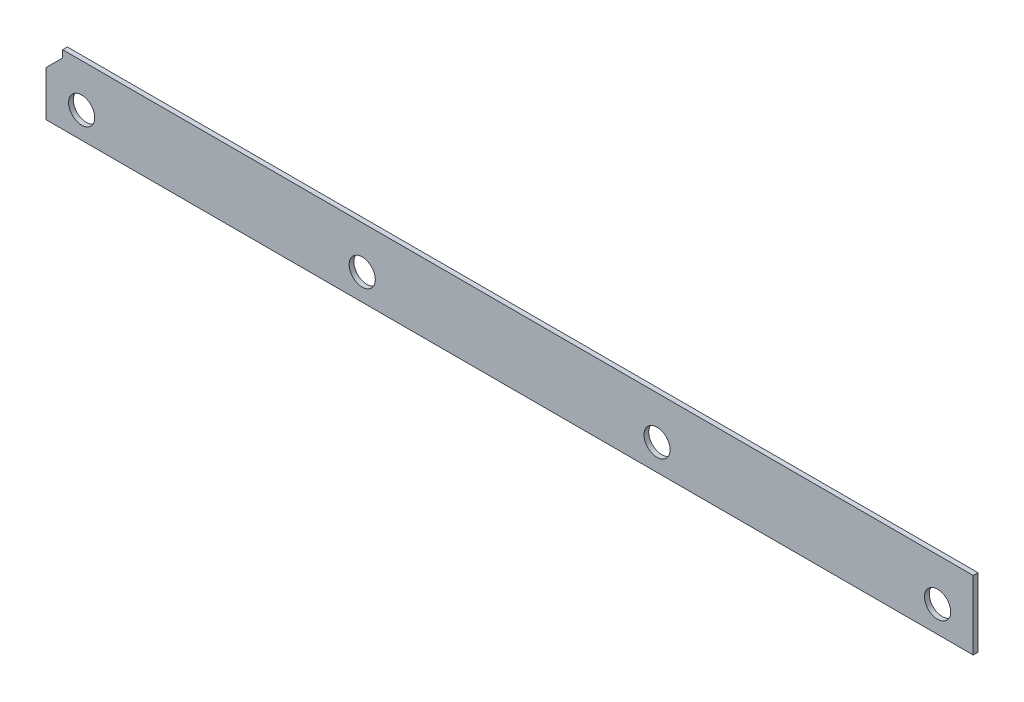
ISO-10303-21;
HEADER;
FILE_DESCRIPTION(('STEP AP214'),'2;1');
FILE_NAME('part.step','',(''),(''),'','','');
FILE_SCHEMA(('AUTOMOTIVE_DESIGN { 1 0 10303 214 1 1 1 1 }'));
ENDSEC;
DATA;
#1=APPLICATION_CONTEXT('core data for automotive mechanical design processes');
#2=APPLICATION_PROTOCOL_DEFINITION('international standard','automotive_design',2000,#1);
#3=PRODUCT_CONTEXT('',#1,'mechanical');
#4=PRODUCT('Part','Part','',(#3));
#5=PRODUCT_RELATED_PRODUCT_CATEGORY('part','',(#4));
#6=PRODUCT_DEFINITION_FORMATION('','',#4);
#7=PRODUCT_DEFINITION_CONTEXT('part definition',#1,'design');
#8=PRODUCT_DEFINITION('design','',#6,#7);
#9=PRODUCT_DEFINITION_SHAPE('','',#8);
#10=(LENGTH_UNIT() NAMED_UNIT(*) SI_UNIT(.MILLI.,.METRE.));
#11=(NAMED_UNIT(*) PLANE_ANGLE_UNIT() SI_UNIT($,.RADIAN.));
#12=(NAMED_UNIT(*) SI_UNIT($,.STERADIAN.) SOLID_ANGLE_UNIT());
#13=UNCERTAINTY_MEASURE_WITH_UNIT(LENGTH_MEASURE(1.E-05),#10,'distance_accuracy_value','');
#14=(GEOMETRIC_REPRESENTATION_CONTEXT(3) GLOBAL_UNCERTAINTY_ASSIGNED_CONTEXT((#13)) GLOBAL_UNIT_ASSIGNED_CONTEXT((#10,
#11,#12)) REPRESENTATION_CONTEXT('',''));
#15=CARTESIAN_POINT('',(0.,0.,0.));
#16=DIRECTION('',(0.,0.,1.));
#17=DIRECTION('',(1.,0.,0.));
#18=AXIS2_PLACEMENT_3D('',#15,#16,#17);
#19=CARTESIAN_POINT('',(0.,0.,1.));
#20=DIRECTION('',(0.,0.,-1.));
#21=DIRECTION('',(-1.,0.,0.));
#22=AXIS2_PLACEMENT_3D('',#19,#20,#21);
#23=PLANE('',#22);
#24=DIRECTION('',(0.,1.,0.));
#25=VECTOR('',#24,1.);
#26=CARTESIAN_POINT('',(97.5,0.,1.));
#27=LINE('',#26,#25);
#28=CARTESIAN_POINT('',(97.5,-14.5,1.));
#29=VERTEX_POINT('',#28);
#30=CARTESIAN_POINT('',(97.5,0.,1.));
#31=VERTEX_POINT('',#30);
#32=EDGE_CURVE('E135',#29,#31,#27,.T.);
#33=ORIENTED_EDGE('',*,*,#32,.T.);
#34=DIRECTION('',(-1.,0.,0.));
#35=VECTOR('',#34,1.);
#36=CARTESIAN_POINT('',(-94.,0.,1.));
#37=LINE('',#36,#35);
#38=CARTESIAN_POINT('',(-94.,0.,1.));
#39=VERTEX_POINT('',#38);
#40=EDGE_CURVE('E93',#31,#39,#37,.T.);
#41=ORIENTED_EDGE('',*,*,#40,.T.);
#42=DIRECTION('',(0.,-1.,0.));
#43=VECTOR('',#42,1.);
#44=CARTESIAN_POINT('',(-94.,-1.5,1.));
#45=LINE('',#44,#43);
#46=CARTESIAN_POINT('',(-94.,-1.5,1.));
#47=VERTEX_POINT('',#46);
#48=EDGE_CURVE('E106',#39,#47,#45,.T.);
#49=ORIENTED_EDGE('',*,*,#48,.T.);
#50=DIRECTION('',(-0.707106781186548,-0.707106781186547,0.));
#51=VECTOR('',#50,1.);
#52=CARTESIAN_POINT('',(-97.5,-5.,1.));
#53=LINE('',#52,#51);
#54=CARTESIAN_POINT('',(-97.5,-5.,1.));
#55=VERTEX_POINT('',#54);
#56=EDGE_CURVE('E100',#47,#55,#53,.T.);
#57=ORIENTED_EDGE('',*,*,#56,.T.);
#58=DIRECTION('',(0.,-1.,0.));
#59=VECTOR('',#58,1.);
#60=CARTESIAN_POINT('',(-97.5,-14.5,1.));
#61=LINE('',#60,#59);
#62=CARTESIAN_POINT('',(-97.5,-14.5,1.));
#63=VERTEX_POINT('',#62);
#64=EDGE_CURVE('E104',#55,#63,#61,.T.);
#65=ORIENTED_EDGE('',*,*,#64,.T.);
#66=DIRECTION('',(1.,0.,0.));
#67=VECTOR('',#66,1.);
#68=CARTESIAN_POINT('',(97.5,-14.5,1.));
#69=LINE('',#68,#67);
#70=EDGE_CURVE('E56',#63,#29,#69,.T.);
#71=ORIENTED_EDGE('',*,*,#70,.T.);
#72=EDGE_LOOP('',(#33,#41,#49,#57,#65,#71));
#73=FACE_BOUND('',#72,.T.);
#74=CARTESIAN_POINT('',(90.,-9.,1.));
#75=DIRECTION('',(0.,0.,1.));
#76=DIRECTION('',(1.,0.,0.));
#77=AXIS2_PLACEMENT_3D('',#74,#75,#76);
#78=CIRCLE('',#77,2.75);
#79=CARTESIAN_POINT('',(92.75,-9.,1.));
#80=VERTEX_POINT('',#79);
#81=EDGE_CURVE('E128',#80,#80,#78,.T.);
#82=ORIENTED_EDGE('',*,*,#81,.F.);
#83=EDGE_LOOP('',(#82));
#84=FACE_BOUND('',#83,.T.);
#85=CARTESIAN_POINT('',(31.,-9.,1.));
#86=DIRECTION('',(0.,0.,1.));
#87=DIRECTION('',(1.,0.,0.));
#88=AXIS2_PLACEMENT_3D('',#85,#86,#87);
#89=CIRCLE('',#88,2.75);
#90=CARTESIAN_POINT('',(33.75,-9.,1.));
#91=VERTEX_POINT('',#90);
#92=EDGE_CURVE('E199',#91,#91,#89,.T.);
#93=ORIENTED_EDGE('',*,*,#92,.F.);
#94=EDGE_LOOP('',(#93));
#95=FACE_BOUND('',#94,.T.);
#96=CARTESIAN_POINT('',(-31.,-9.,1.));
#97=DIRECTION('',(0.,0.,1.));
#98=DIRECTION('',(1.,0.,0.));
#99=AXIS2_PLACEMENT_3D('',#96,#97,#98);
#100=CIRCLE('',#99,2.75);
#101=CARTESIAN_POINT('',(-28.25,-9.,1.));
#102=VERTEX_POINT('',#101);
#103=EDGE_CURVE('E193',#102,#102,#100,.T.);
#104=ORIENTED_EDGE('',*,*,#103,.F.);
#105=EDGE_LOOP('',(#104));
#106=FACE_BOUND('',#105,.T.);
#107=CARTESIAN_POINT('',(-90.,-9.,1.));
#108=DIRECTION('',(0.,0.,1.));
#109=DIRECTION('',(1.,0.,0.));
#110=AXIS2_PLACEMENT_3D('',#107,#108,#109);
#111=CIRCLE('',#110,2.75);
#112=CARTESIAN_POINT('',(-87.25,-9.,1.));
#113=VERTEX_POINT('',#112);
#114=EDGE_CURVE('E184',#113,#113,#111,.T.);
#115=ORIENTED_EDGE('',*,*,#114,.F.);
#116=EDGE_LOOP('',(#115));
#117=FACE_BOUND('',#116,.T.);
#118=ADVANCED_FACE('F39',(#73,#84,#95,#106,#117),#23,.F.);
#119=CARTESIAN_POINT('',(0.,0.,0.));
#120=DIRECTION('',(0.,0.,-1.));
#121=DIRECTION('',(-1.,0.,0.));
#122=AXIS2_PLACEMENT_3D('',#119,#120,#121);
#123=PLANE('',#122);
#124=CARTESIAN_POINT('',(-31.,-9.,0.));
#125=DIRECTION('',(0.,0.,1.));
#126=DIRECTION('',(1.,0.,0.));
#127=AXIS2_PLACEMENT_3D('',#124,#125,#126);
#128=CIRCLE('',#127,2.75);
#129=CARTESIAN_POINT('',(-28.25,-9.,0.));
#130=VERTEX_POINT('',#129);
#131=EDGE_CURVE('E190',#130,#130,#128,.T.);
#132=ORIENTED_EDGE('',*,*,#131,.T.);
#133=EDGE_LOOP('',(#132));
#134=FACE_BOUND('',#133,.T.);
#135=CARTESIAN_POINT('',(90.,-9.,0.));
#136=DIRECTION('',(0.,0.,1.));
#137=DIRECTION('',(1.,0.,0.));
#138=AXIS2_PLACEMENT_3D('',#135,#136,#137);
#139=CIRCLE('',#138,2.75);
#140=CARTESIAN_POINT('',(92.75,-9.,0.));
#141=VERTEX_POINT('',#140);
#142=EDGE_CURVE('E202',#141,#141,#139,.T.);
#143=ORIENTED_EDGE('',*,*,#142,.T.);
#144=EDGE_LOOP('',(#143));
#145=FACE_BOUND('',#144,.T.);
#146=DIRECTION('',(0.,1.,0.));
#147=VECTOR('',#146,1.);
#148=CARTESIAN_POINT('',(97.5,0.,0.));
#149=LINE('',#148,#147);
#150=CARTESIAN_POINT('',(97.5,-14.5,0.));
#151=VERTEX_POINT('',#150);
#152=CARTESIAN_POINT('',(97.5,0.,0.));
#153=VERTEX_POINT('',#152);
#154=EDGE_CURVE('E124',#151,#153,#149,.T.);
#155=ORIENTED_EDGE('',*,*,#154,.F.);
#156=DIRECTION('',(1.,0.,0.));
#157=VECTOR('',#156,1.);
#158=CARTESIAN_POINT('',(97.5,-14.5,0.));
#159=LINE('',#158,#157);
#160=CARTESIAN_POINT('',(-97.5,-14.5,0.));
#161=VERTEX_POINT('',#160);
#162=EDGE_CURVE('E85',#161,#151,#159,.T.);
#163=ORIENTED_EDGE('',*,*,#162,.F.);
#164=DIRECTION('',(0.,-1.,0.));
#165=VECTOR('',#164,1.);
#166=CARTESIAN_POINT('',(-97.5,-14.5,0.));
#167=LINE('',#166,#165);
#168=CARTESIAN_POINT('',(-97.5,-5.,0.));
#169=VERTEX_POINT('',#168);
#170=EDGE_CURVE('E79',#169,#161,#167,.T.);
#171=ORIENTED_EDGE('',*,*,#170,.F.);
#172=DIRECTION('',(-0.707106781186548,-0.707106781186547,0.));
#173=VECTOR('',#172,1.);
#174=CARTESIAN_POINT('',(-97.5,-5.,0.));
#175=LINE('',#174,#173);
#176=CARTESIAN_POINT('',(-94.,-1.5,0.));
#177=VERTEX_POINT('',#176);
#178=EDGE_CURVE('E114',#177,#169,#175,.T.);
#179=ORIENTED_EDGE('',*,*,#178,.F.);
#180=DIRECTION('',(0.,-1.,0.));
#181=VECTOR('',#180,1.);
#182=CARTESIAN_POINT('',(-94.,-1.5,0.));
#183=LINE('',#182,#181);
#184=CARTESIAN_POINT('',(-94.,0.,0.));
#185=VERTEX_POINT('',#184);
#186=EDGE_CURVE('E130',#185,#177,#183,.T.);
#187=ORIENTED_EDGE('',*,*,#186,.F.);
#188=DIRECTION('',(-1.,0.,0.));
#189=VECTOR('',#188,1.);
#190=CARTESIAN_POINT('',(-94.,0.,0.));
#191=LINE('',#190,#189);
#192=EDGE_CURVE('E127',#153,#185,#191,.T.);
#193=ORIENTED_EDGE('',*,*,#192,.F.);
#194=EDGE_LOOP('',(#155,#163,#171,#179,#187,#193));
#195=FACE_BOUND('',#194,.T.);
#196=CARTESIAN_POINT('',(31.,-9.,0.));
#197=DIRECTION('',(0.,0.,1.));
#198=DIRECTION('',(1.,0.,0.));
#199=AXIS2_PLACEMENT_3D('',#196,#197,#198);
#200=CIRCLE('',#199,2.75);
#201=CARTESIAN_POINT('',(33.75,-9.,0.));
#202=VERTEX_POINT('',#201);
#203=EDGE_CURVE('E196',#202,#202,#200,.T.);
#204=ORIENTED_EDGE('',*,*,#203,.T.);
#205=EDGE_LOOP('',(#204));
#206=FACE_BOUND('',#205,.T.);
#207=CARTESIAN_POINT('',(-90.,-9.,0.));
#208=DIRECTION('',(0.,0.,1.));
#209=DIRECTION('',(1.,0.,0.));
#210=AXIS2_PLACEMENT_3D('',#207,#208,#209);
#211=CIRCLE('',#210,2.75);
#212=CARTESIAN_POINT('',(-87.25,-9.,0.));
#213=VERTEX_POINT('',#212);
#214=EDGE_CURVE('E187',#213,#213,#211,.T.);
#215=ORIENTED_EDGE('',*,*,#214,.T.);
#216=EDGE_LOOP('',(#215));
#217=FACE_BOUND('',#216,.T.);
#218=ADVANCED_FACE('F144',(#134,#145,#195,#206,#217),#123,.T.);
#219=CARTESIAN_POINT('',(97.5,0.,1.));
#220=DIRECTION('',(-1.,0.,0.));
#221=DIRECTION('',(0.,0.,1.));
#222=AXIS2_PLACEMENT_3D('',#219,#220,#221);
#223=PLANE('',#222);
#224=ORIENTED_EDGE('',*,*,#154,.T.);
#225=DIRECTION('',(0.,0.,-1.));
#226=VECTOR('',#225,1.);
#227=CARTESIAN_POINT('',(97.5,0.,1.));
#228=LINE('',#227,#226);
#229=EDGE_CURVE('E11',#31,#153,#228,.T.);
#230=ORIENTED_EDGE('',*,*,#229,.F.);
#231=ORIENTED_EDGE('',*,*,#32,.F.);
#232=DIRECTION('',(0.,0.,-1.));
#233=VECTOR('',#232,1.);
#234=CARTESIAN_POINT('',(97.5,-14.5,1.));
#235=LINE('',#234,#233);
#236=EDGE_CURVE('E120',#29,#151,#235,.T.);
#237=ORIENTED_EDGE('',*,*,#236,.T.);
#238=EDGE_LOOP('',(#224,#230,#231,#237));
#239=FACE_BOUND('',#238,.T.);
#240=ADVANCED_FACE('F41',(#239),#223,.F.);
#241=CARTESIAN_POINT('',(-94.,0.,1.));
#242=DIRECTION('',(0.,-1.,0.));
#243=DIRECTION('',(0.,0.,-1.));
#244=AXIS2_PLACEMENT_3D('',#241,#242,#243);
#245=PLANE('',#244);
#246=ORIENTED_EDGE('',*,*,#192,.T.);
#247=DIRECTION('',(0.,0.,-1.));
#248=VECTOR('',#247,1.);
#249=CARTESIAN_POINT('',(-94.,0.,1.));
#250=LINE('',#249,#248);
#251=EDGE_CURVE('E48',#39,#185,#250,.T.);
#252=ORIENTED_EDGE('',*,*,#251,.F.);
#253=ORIENTED_EDGE('',*,*,#40,.F.);
#254=ORIENTED_EDGE('',*,*,#229,.T.);
#255=EDGE_LOOP('',(#246,#252,#253,#254));
#256=FACE_BOUND('',#255,.T.);
#257=ADVANCED_FACE('F266',(#256),#245,.F.);
#258=CARTESIAN_POINT('',(-94.,-1.5,1.));
#259=DIRECTION('',(1.,0.,0.));
#260=DIRECTION('',(0.,0.,-1.));
#261=AXIS2_PLACEMENT_3D('',#258,#259,#260);
#262=PLANE('',#261);
#263=ORIENTED_EDGE('',*,*,#186,.T.);
#264=DIRECTION('',(0.,0.,-1.));
#265=VECTOR('',#264,1.);
#266=CARTESIAN_POINT('',(-94.,-1.5,1.));
#267=LINE('',#266,#265);
#268=EDGE_CURVE('E115',#47,#177,#267,.T.);
#269=ORIENTED_EDGE('',*,*,#268,.F.);
#270=ORIENTED_EDGE('',*,*,#48,.F.);
#271=ORIENTED_EDGE('',*,*,#251,.T.);
#272=EDGE_LOOP('',(#263,#269,#270,#271));
#273=FACE_BOUND('',#272,.T.);
#274=ADVANCED_FACE('F141',(#273),#262,.F.);
#275=CARTESIAN_POINT('',(-97.5,-5.,1.));
#276=DIRECTION('',(0.707106781186547,-0.707106781186548,0.));
#277=DIRECTION('',(0.707106781186548,0.707106781186547,0.));
#278=AXIS2_PLACEMENT_3D('',#275,#276,#277);
#279=PLANE('',#278);
#280=ORIENTED_EDGE('',*,*,#178,.T.);
#281=DIRECTION('',(0.,0.,-1.));
#282=VECTOR('',#281,1.);
#283=CARTESIAN_POINT('',(-97.5,-5.,1.));
#284=LINE('',#283,#282);
#285=EDGE_CURVE('E111',#55,#169,#284,.T.);
#286=ORIENTED_EDGE('',*,*,#285,.F.);
#287=ORIENTED_EDGE('',*,*,#56,.F.);
#288=ORIENTED_EDGE('',*,*,#268,.T.);
#289=EDGE_LOOP('',(#280,#286,#287,#288));
#290=FACE_BOUND('',#289,.T.);
#291=ADVANCED_FACE('F112',(#290),#279,.F.);
#292=CARTESIAN_POINT('',(-97.5,-14.5,1.));
#293=DIRECTION('',(1.,0.,0.));
#294=DIRECTION('',(0.,0.,-1.));
#295=AXIS2_PLACEMENT_3D('',#292,#293,#294);
#296=PLANE('',#295);
#297=ORIENTED_EDGE('',*,*,#170,.T.);
#298=DIRECTION('',(0.,0.,-1.));
#299=VECTOR('',#298,1.);
#300=CARTESIAN_POINT('',(-97.5,-14.5,1.));
#301=LINE('',#300,#299);
#302=EDGE_CURVE('E116',#63,#161,#301,.T.);
#303=ORIENTED_EDGE('',*,*,#302,.F.);
#304=ORIENTED_EDGE('',*,*,#64,.F.);
#305=ORIENTED_EDGE('',*,*,#285,.T.);
#306=EDGE_LOOP('',(#297,#303,#304,#305));
#307=FACE_BOUND('',#306,.T.);
#308=ADVANCED_FACE('F118',(#307),#296,.F.);
#309=CARTESIAN_POINT('',(97.5,-14.5,1.));
#310=DIRECTION('',(0.,1.,0.));
#311=DIRECTION('',(0.,0.,1.));
#312=AXIS2_PLACEMENT_3D('',#309,#310,#311);
#313=PLANE('',#312);
#314=ORIENTED_EDGE('',*,*,#162,.T.);
#315=ORIENTED_EDGE('',*,*,#236,.F.);
#316=ORIENTED_EDGE('',*,*,#70,.F.);
#317=ORIENTED_EDGE('',*,*,#302,.T.);
#318=EDGE_LOOP('',(#314,#315,#316,#317));
#319=FACE_BOUND('',#318,.T.);
#320=ADVANCED_FACE('F149',(#319),#313,.F.);
#321=CARTESIAN_POINT('',(90.,-9.,1.));
#322=DIRECTION('',(0.,0.,-1.));
#323=DIRECTION('',(-1.,0.,0.));
#324=AXIS2_PLACEMENT_3D('',#321,#322,#323);
#325=CYLINDRICAL_SURFACE('',#324,2.75);
#326=ORIENTED_EDGE('',*,*,#81,.T.);
#327=EDGE_LOOP('',(#326));
#328=FACE_BOUND('',#327,.T.);
#329=ORIENTED_EDGE('',*,*,#142,.F.);
#330=EDGE_LOOP('',(#329));
#331=FACE_BOUND('',#330,.T.);
#332=ADVANCED_FACE('F151',(#328,#331),#325,.F.);
#333=CARTESIAN_POINT('',(31.,-9.,1.));
#334=DIRECTION('',(0.,0.,-1.));
#335=DIRECTION('',(-1.,0.,0.));
#336=AXIS2_PLACEMENT_3D('',#333,#334,#335);
#337=CYLINDRICAL_SURFACE('',#336,2.75);
#338=ORIENTED_EDGE('',*,*,#92,.T.);
#339=EDGE_LOOP('',(#338));
#340=FACE_BOUND('',#339,.T.);
#341=ORIENTED_EDGE('',*,*,#203,.F.);
#342=EDGE_LOOP('',(#341));
#343=FACE_BOUND('',#342,.T.);
#344=ADVANCED_FACE('F157',(#340,#343),#337,.F.);
#345=CARTESIAN_POINT('',(-31.,-9.,1.));
#346=DIRECTION('',(0.,0.,-1.));
#347=DIRECTION('',(-1.,0.,0.));
#348=AXIS2_PLACEMENT_3D('',#345,#346,#347);
#349=CYLINDRICAL_SURFACE('',#348,2.75);
#350=ORIENTED_EDGE('',*,*,#103,.T.);
#351=EDGE_LOOP('',(#350));
#352=FACE_BOUND('',#351,.T.);
#353=ORIENTED_EDGE('',*,*,#131,.F.);
#354=EDGE_LOOP('',(#353));
#355=FACE_BOUND('',#354,.T.);
#356=ADVANCED_FACE('F171',(#352,#355),#349,.F.);
#357=CARTESIAN_POINT('',(-90.,-9.,1.));
#358=DIRECTION('',(0.,0.,-1.));
#359=DIRECTION('',(-1.,0.,0.));
#360=AXIS2_PLACEMENT_3D('',#357,#358,#359);
#361=CYLINDRICAL_SURFACE('',#360,2.75);
#362=ORIENTED_EDGE('',*,*,#114,.T.);
#363=EDGE_LOOP('',(#362));
#364=FACE_BOUND('',#363,.T.);
#365=ORIENTED_EDGE('',*,*,#214,.F.);
#366=EDGE_LOOP('',(#365));
#367=FACE_BOUND('',#366,.T.);
#368=ADVANCED_FACE('F175',(#364,#367),#361,.F.);
#369=CLOSED_SHELL('',(#118,#218,#240,#257,#274,#291,#308,#320,#332,#344,#356,#368));
#370=MANIFOLD_SOLID_BREP('B2',#369);
#371=ADVANCED_BREP_SHAPE_REPRESENTATION('',(#18,#370),#14);
#372=SHAPE_DEFINITION_REPRESENTATION(#9,#371);
ENDSEC;
END-ISO-10303-21;
